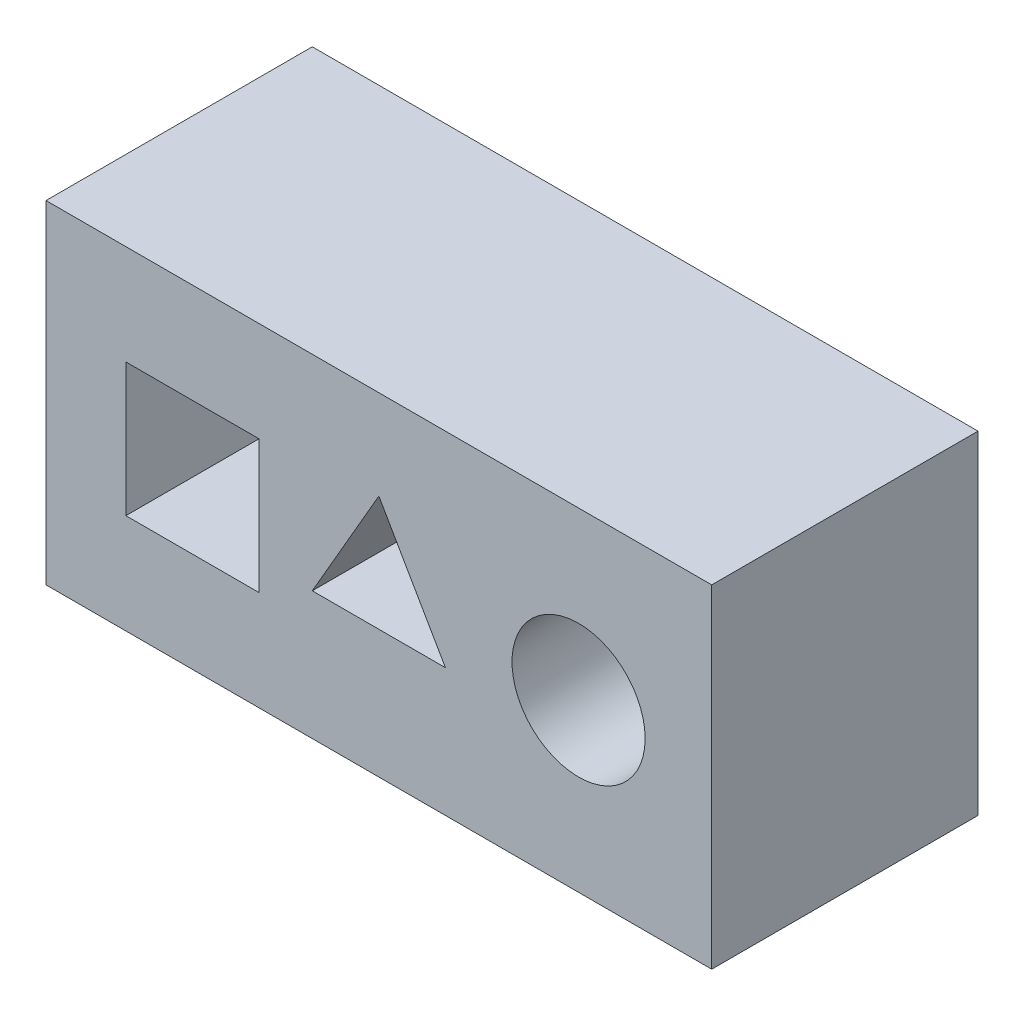
ISO-10303-21;
HEADER;
FILE_DESCRIPTION(('STEP AP214'),'2;1');
FILE_NAME('part.step','',(''),(''),'','','');
FILE_SCHEMA(('AUTOMOTIVE_DESIGN { 1 0 10303 214 1 1 1 1 }'));
ENDSEC;
DATA;
#1=APPLICATION_CONTEXT('core data for automotive mechanical design processes');
#2=APPLICATION_PROTOCOL_DEFINITION('international standard','automotive_design',2000,#1);
#3=PRODUCT_CONTEXT('',#1,'mechanical');
#4=PRODUCT('Part','Part','',(#3));
#5=PRODUCT_RELATED_PRODUCT_CATEGORY('part','',(#4));
#6=PRODUCT_DEFINITION_FORMATION('','',#4);
#7=PRODUCT_DEFINITION_CONTEXT('part definition',#1,'design');
#8=PRODUCT_DEFINITION('design','',#6,#7);
#9=PRODUCT_DEFINITION_SHAPE('','',#8);
#10=(LENGTH_UNIT() NAMED_UNIT(*) SI_UNIT(.MILLI.,.METRE.));
#11=(NAMED_UNIT(*) PLANE_ANGLE_UNIT() SI_UNIT($,.RADIAN.));
#12=(NAMED_UNIT(*) SI_UNIT($,.STERADIAN.) SOLID_ANGLE_UNIT());
#13=UNCERTAINTY_MEASURE_WITH_UNIT(LENGTH_MEASURE(1.E-05),#10,'distance_accuracy_value','');
#14=(GEOMETRIC_REPRESENTATION_CONTEXT(3) GLOBAL_UNCERTAINTY_ASSIGNED_CONTEXT((#13)) GLOBAL_UNIT_ASSIGNED_CONTEXT((#10,
#11,#12)) REPRESENTATION_CONTEXT('',''));
#15=CARTESIAN_POINT('',(0.,0.,0.));
#16=DIRECTION('',(0.,0.,1.));
#17=DIRECTION('',(1.,0.,0.));
#18=AXIS2_PLACEMENT_3D('',#15,#16,#17);
#19=CARTESIAN_POINT('',(0.,0.,100.));
#20=DIRECTION('',(0.,0.,1.));
#21=DIRECTION('',(1.,0.,0.));
#22=AXIS2_PLACEMENT_3D('',#19,#20,#21);
#23=PLANE('',#22);
#24=DIRECTION('',(0.,-1.,0.));
#25=VECTOR('',#24,1.);
#26=CARTESIAN_POINT('',(-125.,-62.5,100.));
#27=LINE('',#26,#25);
#28=CARTESIAN_POINT('',(-125.,62.5,100.));
#29=VERTEX_POINT('',#28);
#30=CARTESIAN_POINT('',(-125.,-62.5,100.));
#31=VERTEX_POINT('',#30);
#32=EDGE_CURVE('E203',#29,#31,#27,.T.);
#33=ORIENTED_EDGE('',*,*,#32,.T.);
#34=DIRECTION('',(1.,0.,0.));
#35=VECTOR('',#34,1.);
#36=CARTESIAN_POINT('',(125.,-62.5,100.));
#37=LINE('',#36,#35);
#38=CARTESIAN_POINT('',(125.,-62.5,100.));
#39=VERTEX_POINT('',#38);
#40=EDGE_CURVE('E91',#31,#39,#37,.T.);
#41=ORIENTED_EDGE('',*,*,#40,.T.);
#42=DIRECTION('',(0.,1.,0.));
#43=VECTOR('',#42,1.);
#44=CARTESIAN_POINT('',(125.,-62.5,100.));
#45=LINE('',#44,#43);
#46=CARTESIAN_POINT('',(125.,62.5,100.));
#47=VERTEX_POINT('',#46);
#48=EDGE_CURVE('E208',#39,#47,#45,.T.);
#49=ORIENTED_EDGE('',*,*,#48,.T.);
#50=DIRECTION('',(-1.,0.,0.));
#51=VECTOR('',#50,1.);
#52=CARTESIAN_POINT('',(125.,62.5,100.));
#53=LINE('',#52,#51);
#54=EDGE_CURVE('E60',#47,#29,#53,.T.);
#55=ORIENTED_EDGE('',*,*,#54,.T.);
#56=EDGE_LOOP('',(#33,#41,#49,#55));
#57=FACE_BOUND('',#56,.T.);
#58=CARTESIAN_POINT('',(74.9999999999999,0.,100.));
#59=DIRECTION('',(0.,0.,1.));
#60=DIRECTION('',(1.,0.,0.));
#61=AXIS2_PLACEMENT_3D('',#58,#59,#60);
#62=CIRCLE('',#61,25.);
#63=CARTESIAN_POINT('',(99.9999999999999,0.,100.));
#64=VERTEX_POINT('',#63);
#65=EDGE_CURVE('E304',#64,#64,#62,.T.);
#66=ORIENTED_EDGE('',*,*,#65,.F.);
#67=EDGE_LOOP('',(#66));
#68=FACE_BOUND('',#67,.T.);
#69=DIRECTION('',(1.,0.,0.));
#70=VECTOR('',#69,1.);
#71=CARTESIAN_POINT('',(0.,25.,100.));
#72=LINE('',#71,#70);
#73=CARTESIAN_POINT('',(-95.,25.,100.));
#74=VERTEX_POINT('',#73);
#75=CARTESIAN_POINT('',(-45.,25.,100.));
#76=VERTEX_POINT('',#75);
#77=EDGE_CURVE('E292',#74,#76,#72,.T.);
#78=ORIENTED_EDGE('',*,*,#77,.T.);
#79=DIRECTION('',(0.,-1.,0.));
#80=VECTOR('',#79,1.);
#81=CARTESIAN_POINT('',(-45.,0.,100.));
#82=LINE('',#81,#80);
#83=CARTESIAN_POINT('',(-45.,-25.,100.));
#84=VERTEX_POINT('',#83);
#85=EDGE_CURVE('E288',#76,#84,#82,.T.);
#86=ORIENTED_EDGE('',*,*,#85,.T.);
#87=DIRECTION('',(1.,0.,0.));
#88=VECTOR('',#87,1.);
#89=CARTESIAN_POINT('',(0.,-25.,100.));
#90=LINE('',#89,#88);
#91=CARTESIAN_POINT('',(-95.,-25.,100.));
#92=VERTEX_POINT('',#91);
#93=EDGE_CURVE('E176',#92,#84,#90,.T.);
#94=ORIENTED_EDGE('',*,*,#93,.F.);
#95=DIRECTION('',(0.,-1.,0.));
#96=VECTOR('',#95,1.);
#97=CARTESIAN_POINT('',(-95.,0.,100.));
#98=LINE('',#97,#96);
#99=EDGE_CURVE('E181',#74,#92,#98,.T.);
#100=ORIENTED_EDGE('',*,*,#99,.F.);
#101=EDGE_LOOP('',(#78,#86,#94,#100));
#102=FACE_BOUND('',#101,.T.);
#103=DIRECTION('',(0.5,-0.866025403784439,0.));
#104=VECTOR('',#103,1.);
#105=CARTESIAN_POINT('',(12.5,7.21687836487032,100.));
#106=LINE('',#105,#104);
#107=CARTESIAN_POINT('',(0.,28.8675134594813,100.));
#108=VERTEX_POINT('',#107);
#109=CARTESIAN_POINT('',(25.,-14.4337567297406,100.));
#110=VERTEX_POINT('',#109);
#111=EDGE_CURVE('E159',#108,#110,#106,.T.);
#112=ORIENTED_EDGE('',*,*,#111,.T.);
#113=DIRECTION('',(-1.,0.,0.));
#114=VECTOR('',#113,1.);
#115=CARTESIAN_POINT('',(0.,-14.4337567297406,100.));
#116=LINE('',#115,#114);
#117=CARTESIAN_POINT('',(-25.,-14.4337567297406,100.));
#118=VERTEX_POINT('',#117);
#119=EDGE_CURVE('E283',#110,#118,#116,.T.);
#120=ORIENTED_EDGE('',*,*,#119,.T.);
#121=DIRECTION('',(0.5,0.866025403784439,0.));
#122=VECTOR('',#121,1.);
#123=CARTESIAN_POINT('',(-12.5,7.21687836487033,100.));
#124=LINE('',#123,#122);
#125=EDGE_CURVE('E147',#118,#108,#124,.T.);
#126=ORIENTED_EDGE('',*,*,#125,.T.);
#127=EDGE_LOOP('',(#112,#120,#126));
#128=FACE_BOUND('',#127,.T.);
#129=ADVANCED_FACE('F42',(#57,#68,#102,#128),#23,.T.);
#130=CARTESIAN_POINT('',(0.,0.,0.));
#131=DIRECTION('',(0.,0.,1.));
#132=DIRECTION('',(1.,0.,0.));
#133=AXIS2_PLACEMENT_3D('',#130,#131,#132);
#134=PLANE('',#133);
#135=DIRECTION('',(0.,-1.,0.));
#136=VECTOR('',#135,1.);
#137=CARTESIAN_POINT('',(-125.,-62.5,0.));
#138=LINE('',#137,#136);
#139=CARTESIAN_POINT('',(-125.,62.5,0.));
#140=VERTEX_POINT('',#139);
#141=CARTESIAN_POINT('',(-125.,-62.5,0.));
#142=VERTEX_POINT('',#141);
#143=EDGE_CURVE('E202',#140,#142,#138,.T.);
#144=ORIENTED_EDGE('',*,*,#143,.F.);
#145=DIRECTION('',(-1.,0.,0.));
#146=VECTOR('',#145,1.);
#147=CARTESIAN_POINT('',(125.,62.5,0.));
#148=LINE('',#147,#146);
#149=CARTESIAN_POINT('',(125.,62.5,0.));
#150=VERTEX_POINT('',#149);
#151=EDGE_CURVE('E84',#150,#140,#148,.T.);
#152=ORIENTED_EDGE('',*,*,#151,.F.);
#153=DIRECTION('',(0.,1.,0.));
#154=VECTOR('',#153,1.);
#155=CARTESIAN_POINT('',(125.,-62.5,0.));
#156=LINE('',#155,#154);
#157=CARTESIAN_POINT('',(125.,-62.5,0.));
#158=VERTEX_POINT('',#157);
#159=EDGE_CURVE('E78',#158,#150,#156,.T.);
#160=ORIENTED_EDGE('',*,*,#159,.F.);
#161=DIRECTION('',(1.,0.,0.));
#162=VECTOR('',#161,1.);
#163=CARTESIAN_POINT('',(125.,-62.5,0.));
#164=LINE('',#163,#162);
#165=EDGE_CURVE('E217',#142,#158,#164,.T.);
#166=ORIENTED_EDGE('',*,*,#165,.F.);
#167=EDGE_LOOP('',(#144,#152,#160,#166));
#168=FACE_BOUND('',#167,.T.);
#169=DIRECTION('',(-0.5,0.866025403784439,0.));
#170=VECTOR('',#169,1.);
#171=CARTESIAN_POINT('',(12.5,7.21687836487032,0.));
#172=LINE('',#171,#170);
#173=CARTESIAN_POINT('',(25.,-14.4337567297406,0.));
#174=VERTEX_POINT('',#173);
#175=CARTESIAN_POINT('',(0.,28.8675134594813,0.));
#176=VERTEX_POINT('',#175);
#177=EDGE_CURVE('E135',#174,#176,#172,.T.);
#178=ORIENTED_EDGE('',*,*,#177,.T.);
#179=DIRECTION('',(-0.5,-0.866025403784439,0.));
#180=VECTOR('',#179,1.);
#181=CARTESIAN_POINT('',(-12.5,7.21687836487033,0.));
#182=LINE('',#181,#180);
#183=CARTESIAN_POINT('',(-25.,-14.4337567297406,-1.11022302462516E-13));
#184=VERTEX_POINT('',#183);
#185=EDGE_CURVE('E139',#176,#184,#182,.T.);
#186=ORIENTED_EDGE('',*,*,#185,.T.);
#187=DIRECTION('',(1.,0.,0.));
#188=VECTOR('',#187,1.);
#189=CARTESIAN_POINT('',(0.,-14.4337567297406,0.));
#190=LINE('',#189,#188);
#191=EDGE_CURVE('E142',#184,#174,#190,.T.);
#192=ORIENTED_EDGE('',*,*,#191,.T.);
#193=EDGE_LOOP('',(#178,#186,#192));
#194=FACE_BOUND('',#193,.T.);
#195=DIRECTION('',(-1.,0.,0.));
#196=VECTOR('',#195,1.);
#197=CARTESIAN_POINT('',(0.,25.,0.));
#198=LINE('',#197,#196);
#199=CARTESIAN_POINT('',(-45.,25.,0.));
#200=VERTEX_POINT('',#199);
#201=CARTESIAN_POINT('',(-95.,25.,0.));
#202=VERTEX_POINT('',#201);
#203=EDGE_CURVE('E190',#200,#202,#198,.T.);
#204=ORIENTED_EDGE('',*,*,#203,.T.);
#205=DIRECTION('',(0.,1.,0.));
#206=VECTOR('',#205,1.);
#207=CARTESIAN_POINT('',(-95.,0.,0.));
#208=LINE('',#207,#206);
#209=CARTESIAN_POINT('',(-95.,-25.,0.));
#210=VERTEX_POINT('',#209);
#211=EDGE_CURVE('E167',#210,#202,#208,.T.);
#212=ORIENTED_EDGE('',*,*,#211,.F.);
#213=DIRECTION('',(-1.,0.,0.));
#214=VECTOR('',#213,1.);
#215=CARTESIAN_POINT('',(0.,-25.,0.));
#216=LINE('',#215,#214);
#217=CARTESIAN_POINT('',(-45.,-25.,-1.11022302462516E-13));
#218=VERTEX_POINT('',#217);
#219=EDGE_CURVE('E185',#218,#210,#216,.T.);
#220=ORIENTED_EDGE('',*,*,#219,.F.);
#221=DIRECTION('',(0.,1.,0.));
#222=VECTOR('',#221,1.);
#223=CARTESIAN_POINT('',(-45.,0.,0.));
#224=LINE('',#223,#222);
#225=EDGE_CURVE('E193',#218,#200,#224,.T.);
#226=ORIENTED_EDGE('',*,*,#225,.T.);
#227=EDGE_LOOP('',(#204,#212,#220,#226));
#228=FACE_BOUND('',#227,.T.);
#229=CARTESIAN_POINT('',(74.9999999999999,0.,0.));
#230=DIRECTION('',(0.,0.,1.));
#231=DIRECTION('',(1.,0.,0.));
#232=AXIS2_PLACEMENT_3D('',#229,#230,#231);
#233=CIRCLE('',#232,25.);
#234=CARTESIAN_POINT('',(99.9999999999999,0.,0.));
#235=VERTEX_POINT('',#234);
#236=EDGE_CURVE('E172',#235,#235,#233,.F.);
#237=ORIENTED_EDGE('',*,*,#236,.F.);
#238=EDGE_LOOP('',(#237));
#239=FACE_BOUND('',#238,.T.);
#240=ADVANCED_FACE('F137',(#168,#194,#228,#239),#134,.F.);
#241=CARTESIAN_POINT('',(-125.,-62.5,100.));
#242=DIRECTION('',(1.,0.,0.));
#243=DIRECTION('',(0.,0.,-1.));
#244=AXIS2_PLACEMENT_3D('',#241,#242,#243);
#245=PLANE('',#244);
#246=ORIENTED_EDGE('',*,*,#143,.T.);
#247=DIRECTION('',(0.,0.,-1.));
#248=VECTOR('',#247,1.);
#249=CARTESIAN_POINT('',(-125.,-62.5,100.));
#250=LINE('',#249,#248);
#251=EDGE_CURVE('E11',#31,#142,#250,.T.);
#252=ORIENTED_EDGE('',*,*,#251,.F.);
#253=ORIENTED_EDGE('',*,*,#32,.F.);
#254=DIRECTION('',(0.,0.,-1.));
#255=VECTOR('',#254,1.);
#256=CARTESIAN_POINT('',(-125.,62.5,100.));
#257=LINE('',#256,#255);
#258=EDGE_CURVE('E213',#29,#140,#257,.T.);
#259=ORIENTED_EDGE('',*,*,#258,.T.);
#260=EDGE_LOOP('',(#246,#252,#253,#259));
#261=FACE_BOUND('',#260,.T.);
#262=ADVANCED_FACE('F44',(#261),#245,.F.);
#263=CARTESIAN_POINT('',(125.,-62.5,100.));
#264=DIRECTION('',(0.,1.,0.));
#265=DIRECTION('',(-1.,0.,0.));
#266=AXIS2_PLACEMENT_3D('',#263,#264,#265);
#267=PLANE('',#266);
#268=ORIENTED_EDGE('',*,*,#165,.T.);
#269=DIRECTION('',(0.,0.,-1.));
#270=VECTOR('',#269,1.);
#271=CARTESIAN_POINT('',(125.,-62.5,100.));
#272=LINE('',#271,#270);
#273=EDGE_CURVE('E52',#39,#158,#272,.T.);
#274=ORIENTED_EDGE('',*,*,#273,.F.);
#275=ORIENTED_EDGE('',*,*,#40,.F.);
#276=ORIENTED_EDGE('',*,*,#251,.T.);
#277=EDGE_LOOP('',(#268,#274,#275,#276));
#278=FACE_BOUND('',#277,.T.);
#279=ADVANCED_FACE('F244',(#278),#267,.F.);
#280=CARTESIAN_POINT('',(125.,-62.5,100.));
#281=DIRECTION('',(-1.,0.,0.));
#282=DIRECTION('',(0.,0.,1.));
#283=AXIS2_PLACEMENT_3D('',#280,#281,#282);
#284=PLANE('',#283);
#285=ORIENTED_EDGE('',*,*,#159,.T.);
#286=DIRECTION('',(0.,0.,-1.));
#287=VECTOR('',#286,1.);
#288=CARTESIAN_POINT('',(125.,62.5,100.));
#289=LINE('',#288,#287);
#290=EDGE_CURVE('E226',#47,#150,#289,.T.);
#291=ORIENTED_EDGE('',*,*,#290,.F.);
#292=ORIENTED_EDGE('',*,*,#48,.F.);
#293=ORIENTED_EDGE('',*,*,#273,.T.);
#294=EDGE_LOOP('',(#285,#291,#292,#293));
#295=FACE_BOUND('',#294,.T.);
#296=ADVANCED_FACE('F230',(#295),#284,.F.);
#297=CARTESIAN_POINT('',(125.,62.5,100.));
#298=DIRECTION('',(0.,-1.,0.));
#299=DIRECTION('',(1.,0.,0.));
#300=AXIS2_PLACEMENT_3D('',#297,#298,#299);
#301=PLANE('',#300);
#302=ORIENTED_EDGE('',*,*,#151,.T.);
#303=ORIENTED_EDGE('',*,*,#258,.F.);
#304=ORIENTED_EDGE('',*,*,#54,.F.);
#305=ORIENTED_EDGE('',*,*,#290,.T.);
#306=EDGE_LOOP('',(#302,#303,#304,#305));
#307=FACE_BOUND('',#306,.T.);
#308=ADVANCED_FACE('F236',(#307),#301,.F.);
#309=CARTESIAN_POINT('',(12.5,7.21687836487032,-279.508497187474));
#310=DIRECTION('',(-0.866025403784439,-0.5,0.));
#311=DIRECTION('',(0.5,-0.866025403784439,0.));
#312=AXIS2_PLACEMENT_3D('',#309,#310,#311);
#313=PLANE('',#312);
#314=ORIENTED_EDGE('',*,*,#177,.F.);
#315=DIRECTION('',(0.,0.,1.));
#316=VECTOR('',#315,1.);
#317=CARTESIAN_POINT('',(25.,-14.4337567297406,-279.508497187474));
#318=LINE('',#317,#316);
#319=EDGE_CURVE('E163',#174,#110,#318,.T.);
#320=ORIENTED_EDGE('',*,*,#319,.T.);
#321=ORIENTED_EDGE('',*,*,#111,.F.);
#322=DIRECTION('',(0.,0.,1.));
#323=VECTOR('',#322,1.);
#324=CARTESIAN_POINT('',(0.,28.8675134594813,-279.508497187474));
#325=LINE('',#324,#323);
#326=EDGE_CURVE('E152',#176,#108,#325,.T.);
#327=ORIENTED_EDGE('',*,*,#326,.F.);
#328=EDGE_LOOP('',(#314,#320,#321,#327));
#329=FACE_BOUND('',#328,.T.);
#330=ADVANCED_FACE('F157',(#329),#313,.T.);
#331=CARTESIAN_POINT('',(-12.5,7.21687836487033,-279.508497187474));
#332=DIRECTION('',(0.866025403784439,-0.5,0.));
#333=DIRECTION('',(0.5,0.866025403784439,0.));
#334=AXIS2_PLACEMENT_3D('',#331,#332,#333);
#335=PLANE('',#334);
#336=ORIENTED_EDGE('',*,*,#185,.F.);
#337=ORIENTED_EDGE('',*,*,#326,.T.);
#338=ORIENTED_EDGE('',*,*,#125,.F.);
#339=DIRECTION('',(0.,0.,1.));
#340=VECTOR('',#339,1.);
#341=CARTESIAN_POINT('',(-25.,-14.4337567297406,-279.508497187474));
#342=LINE('',#341,#340);
#343=EDGE_CURVE('E154',#184,#118,#342,.T.);
#344=ORIENTED_EDGE('',*,*,#343,.F.);
#345=EDGE_LOOP('',(#336,#337,#338,#344));
#346=FACE_BOUND('',#345,.T.);
#347=ADVANCED_FACE('F150',(#346),#335,.T.);
#348=CARTESIAN_POINT('',(0.,25.,-279.508497187474));
#349=DIRECTION('',(0.,-1.,0.));
#350=DIRECTION('',(0.,0.,-1.));
#351=AXIS2_PLACEMENT_3D('',#348,#349,#350);
#352=PLANE('',#351);
#353=ORIENTED_EDGE('',*,*,#203,.F.);
#354=DIRECTION('',(0.,0.,1.));
#355=VECTOR('',#354,1.);
#356=CARTESIAN_POINT('',(-45.,25.,-279.508497187474));
#357=LINE('',#356,#355);
#358=EDGE_CURVE('E162',#200,#76,#357,.T.);
#359=ORIENTED_EDGE('',*,*,#358,.T.);
#360=ORIENTED_EDGE('',*,*,#77,.F.);
#361=DIRECTION('',(0.,0.,1.));
#362=VECTOR('',#361,1.);
#363=CARTESIAN_POINT('',(-95.,25.,-279.508497187474));
#364=LINE('',#363,#362);
#365=EDGE_CURVE('E178',#202,#74,#364,.T.);
#366=ORIENTED_EDGE('',*,*,#365,.F.);
#367=EDGE_LOOP('',(#353,#359,#360,#366));
#368=FACE_BOUND('',#367,.T.);
#369=ADVANCED_FACE('F259',(#368),#352,.T.);
#370=CARTESIAN_POINT('',(-95.,0.,-279.508497187474));
#371=DIRECTION('',(-1.,0.,0.));
#372=DIRECTION('',(0.,0.,1.));
#373=AXIS2_PLACEMENT_3D('',#370,#371,#372);
#374=PLANE('',#373);
#375=DIRECTION('',(0.,0.,1.));
#376=VECTOR('',#375,1.);
#377=CARTESIAN_POINT('',(-95.,-25.,-279.508497187474));
#378=LINE('',#377,#376);
#379=EDGE_CURVE('E182',#210,#92,#378,.T.);
#380=ORIENTED_EDGE('',*,*,#379,.F.);
#381=ORIENTED_EDGE('',*,*,#211,.T.);
#382=ORIENTED_EDGE('',*,*,#365,.T.);
#383=ORIENTED_EDGE('',*,*,#99,.T.);
#384=EDGE_LOOP('',(#380,#381,#382,#383));
#385=FACE_BOUND('',#384,.T.);
#386=ADVANCED_FACE('F262',(#385),#374,.F.);
#387=CARTESIAN_POINT('',(0.,-25.,-279.508497187474));
#388=DIRECTION('',(0.,-1.,0.));
#389=DIRECTION('',(0.,0.,-1.));
#390=AXIS2_PLACEMENT_3D('',#387,#388,#389);
#391=PLANE('',#390);
#392=DIRECTION('',(0.,0.,1.));
#393=VECTOR('',#392,1.);
#394=CARTESIAN_POINT('',(-45.,-25.,-279.508497187474));
#395=LINE('',#394,#393);
#396=EDGE_CURVE('E175',#218,#84,#395,.T.);
#397=ORIENTED_EDGE('',*,*,#396,.F.);
#398=ORIENTED_EDGE('',*,*,#219,.T.);
#399=ORIENTED_EDGE('',*,*,#379,.T.);
#400=ORIENTED_EDGE('',*,*,#93,.T.);
#401=EDGE_LOOP('',(#397,#398,#399,#400));
#402=FACE_BOUND('',#401,.T.);
#403=ADVANCED_FACE('F266',(#402),#391,.F.);
#404=CARTESIAN_POINT('',(0.,-14.4337567297406,-279.508497187474));
#405=DIRECTION('',(0.,1.,0.));
#406=DIRECTION('',(-1.,0.,0.));
#407=AXIS2_PLACEMENT_3D('',#404,#405,#406);
#408=PLANE('',#407);
#409=ORIENTED_EDGE('',*,*,#191,.F.);
#410=ORIENTED_EDGE('',*,*,#343,.T.);
#411=ORIENTED_EDGE('',*,*,#119,.F.);
#412=ORIENTED_EDGE('',*,*,#319,.F.);
#413=EDGE_LOOP('',(#409,#410,#411,#412));
#414=FACE_BOUND('',#413,.T.);
#415=ADVANCED_FACE('F270',(#414),#408,.T.);
#416=CARTESIAN_POINT('',(-45.,0.,-279.508497187474));
#417=DIRECTION('',(-1.,0.,0.));
#418=DIRECTION('',(0.,0.,1.));
#419=AXIS2_PLACEMENT_3D('',#416,#417,#418);
#420=PLANE('',#419);
#421=ORIENTED_EDGE('',*,*,#225,.F.);
#422=ORIENTED_EDGE('',*,*,#396,.T.);
#423=ORIENTED_EDGE('',*,*,#85,.F.);
#424=ORIENTED_EDGE('',*,*,#358,.F.);
#425=EDGE_LOOP('',(#421,#422,#423,#424));
#426=FACE_BOUND('',#425,.T.);
#427=ADVANCED_FACE('F257',(#426),#420,.T.);
#428=CARTESIAN_POINT('',(74.9999999999999,0.,-279.508497187474));
#429=DIRECTION('',(0.,0.,1.));
#430=DIRECTION('',(1.,0.,0.));
#431=AXIS2_PLACEMENT_3D('',#428,#429,#430);
#432=CYLINDRICAL_SURFACE('',#431,25.);
#433=CARTESIAN_POINT('',(99.9999999999999,0.,0.));
#434=CARTESIAN_POINT('',(99.9999999999999,0.,1.04166666666661));
#435=CARTESIAN_POINT('',(99.9999999999999,0.,2.08333333333327));
#436=CARTESIAN_POINT('',(99.9999999999999,0.,4.1666666666666));
#437=CARTESIAN_POINT('',(99.9999999999999,0.,5.20833333333326));
#438=CARTESIAN_POINT('',(99.9999999999999,0.,7.2916666666666));
#439=CARTESIAN_POINT('',(99.9999999999999,0.,8.33333333333329));
#440=CARTESIAN_POINT('',(99.9999999999999,0.,10.4166666666666));
#441=CARTESIAN_POINT('',(99.9999999999999,0.,11.4583333333333));
#442=CARTESIAN_POINT('',(99.9999999999999,0.,13.5416666666666));
#443=CARTESIAN_POINT('',(99.9999999999999,0.,14.5833333333333));
#444=CARTESIAN_POINT('',(99.9999999999999,0.,16.6666666666666));
#445=CARTESIAN_POINT('',(99.9999999999999,0.,17.7083333333333));
#446=CARTESIAN_POINT('',(99.9999999999999,0.,19.7916666666667));
#447=CARTESIAN_POINT('',(99.9999999999999,0.,20.8333333333333));
#448=CARTESIAN_POINT('',(99.9999999999999,0.,22.9166666666666));
#449=CARTESIAN_POINT('',(99.9999999999999,0.,23.9583333333333));
#450=CARTESIAN_POINT('',(99.9999999999999,0.,26.0416666666666));
#451=CARTESIAN_POINT('',(99.9999999999999,0.,27.0833333333333));
#452=CARTESIAN_POINT('',(99.9999999999999,0.,29.1666666666666));
#453=CARTESIAN_POINT('',(99.9999999999999,0.,30.2083333333333));
#454=CARTESIAN_POINT('',(99.9999999999999,0.,32.2916666666666));
#455=CARTESIAN_POINT('',(99.9999999999999,0.,33.3333333333333));
#456=CARTESIAN_POINT('',(99.9999999999999,0.,35.4166666666667));
#457=CARTESIAN_POINT('',(99.9999999999999,0.,36.4583333333333));
#458=CARTESIAN_POINT('',(99.9999999999999,0.,38.5416666666666));
#459=CARTESIAN_POINT('',(99.9999999999999,0.,39.5833333333333));
#460=CARTESIAN_POINT('',(99.9999999999999,0.,41.6666666666667));
#461=CARTESIAN_POINT('',(99.9999999999999,0.,42.7083333333333));
#462=CARTESIAN_POINT('',(99.9999999999999,0.,44.7916666666667));
#463=CARTESIAN_POINT('',(99.9999999999999,0.,45.8333333333333));
#464=CARTESIAN_POINT('',(99.9999999999999,0.,47.9166666666667));
#465=CARTESIAN_POINT('',(99.9999999999999,0.,48.9583333333333));
#466=CARTESIAN_POINT('',(99.9999999999999,0.,51.0416666666667));
#467=CARTESIAN_POINT('',(99.9999999999999,0.,52.0833333333333));
#468=CARTESIAN_POINT('',(99.9999999999999,0.,54.1666666666666));
#469=CARTESIAN_POINT('',(99.9999999999999,0.,55.2083333333333));
#470=CARTESIAN_POINT('',(99.9999999999999,0.,57.2916666666667));
#471=CARTESIAN_POINT('',(99.9999999999999,0.,58.3333333333333));
#472=CARTESIAN_POINT('',(99.9999999999999,0.,60.4166666666667));
#473=CARTESIAN_POINT('',(99.9999999999999,0.,61.4583333333333));
#474=CARTESIAN_POINT('',(99.9999999999999,0.,63.5416666666667));
#475=CARTESIAN_POINT('',(99.9999999999999,0.,64.5833333333333));
#476=CARTESIAN_POINT('',(99.9999999999999,0.,66.6666666666667));
#477=CARTESIAN_POINT('',(99.9999999999999,0.,67.7083333333334));
#478=CARTESIAN_POINT('',(99.9999999999999,0.,69.7916666666667));
#479=CARTESIAN_POINT('',(99.9999999999999,0.,70.8333333333334));
#480=CARTESIAN_POINT('',(99.9999999999999,0.,72.9166666666667));
#481=CARTESIAN_POINT('',(99.9999999999999,0.,73.9583333333333));
#482=CARTESIAN_POINT('',(99.9999999999999,0.,76.0416666666667));
#483=CARTESIAN_POINT('',(99.9999999999999,0.,77.0833333333333));
#484=CARTESIAN_POINT('',(99.9999999999999,0.,79.1666666666667));
#485=CARTESIAN_POINT('',(99.9999999999999,0.,80.2083333333333));
#486=CARTESIAN_POINT('',(99.9999999999999,0.,82.2916666666667));
#487=CARTESIAN_POINT('',(99.9999999999999,0.,83.3333333333334));
#488=CARTESIAN_POINT('',(99.9999999999999,0.,85.4166666666667));
#489=CARTESIAN_POINT('',(99.9999999999999,0.,86.4583333333334));
#490=CARTESIAN_POINT('',(99.9999999999999,0.,88.5416666666667));
#491=CARTESIAN_POINT('',(99.9999999999999,0.,89.5833333333333));
#492=CARTESIAN_POINT('',(99.9999999999999,0.,91.6666666666667));
#493=CARTESIAN_POINT('',(99.9999999999999,0.,92.7083333333334));
#494=CARTESIAN_POINT('',(99.9999999999999,0.,94.7916666666667));
#495=CARTESIAN_POINT('',(99.9999999999999,0.,95.8333333333334));
#496=CARTESIAN_POINT('',(99.9999999999999,0.,97.9166666666667));
#497=CARTESIAN_POINT('',(99.9999999999999,0.,98.9583333333334));
#498=CARTESIAN_POINT('',(99.9999999999999,0.,100.));
#499=B_SPLINE_CURVE_WITH_KNOTS('',3,(#433,#434,#435,#436,#437,#438,#439,#440,#441,#442,#443,
#444,#445,#446,#447,#448,#449,#450,#451,#452,#453,#454,#455,#456,#457,#458,#459,#460,#461,#462,
#463,#464,#465,#466,#467,#468,#469,#470,#471,#472,#473,#474,#475,#476,#477,#478,#479,#480,#481,
#482,#483,#484,#485,#486,#487,#488,#489,#490,#491,#492,#493,#494,#495,#496,#497,#498),
.UNSPECIFIED.,.F.,.F.,(4,2,2,2,2,2,2,2,2,2,2,2,2,2,2,2,2,2,2,2,2,2,2,2,2,2,2,2,2,2,2,2,4),(0.,
3.12499999999999,6.24999999999998,9.37500000000002,12.5,15.625,18.75,21.875,25.,28.125,31.25,
34.375,37.5,40.625,43.7500000000001,46.8750000000001,50.,53.125,56.25,59.3750000000001,
62.5000000000001,65.625,68.7500000000001,71.8750000000001,75.0000000000001,78.1250000000001,
81.25,84.3750000000001,87.5000000000001,90.6250000000001,93.7500000000001,96.8750000000001,
100.),.UNSPECIFIED.);
#500=EDGE_CURVE('BSEAM254',#235,#64,#499,.T.);
#501=ORIENTED_EDGE('',*,*,#236,.T.);
#502=ORIENTED_EDGE('',*,*,#65,.T.);
#503=ORIENTED_EDGE('',*,*,#500,.T.);
#504=ORIENTED_EDGE('',*,*,#500,.F.);
#505=EDGE_LOOP('',(#501,#503,#502,#504));
#506=FACE_BOUND('',#505,.T.);
#507=ADVANCED_FACE('F254',(#506),#432,.F.);
#508=CLOSED_SHELL('',(#129,#240,#262,#279,#296,#308,#330,#347,#369,#386,#403,#415,#427,#507));
#509=MANIFOLD_SOLID_BREP('B2',#508);
#510=ADVANCED_BREP_SHAPE_REPRESENTATION('',(#18,#509),#14);
#511=SHAPE_DEFINITION_REPRESENTATION(#9,#510);
ENDSEC;
END-ISO-10303-21;
